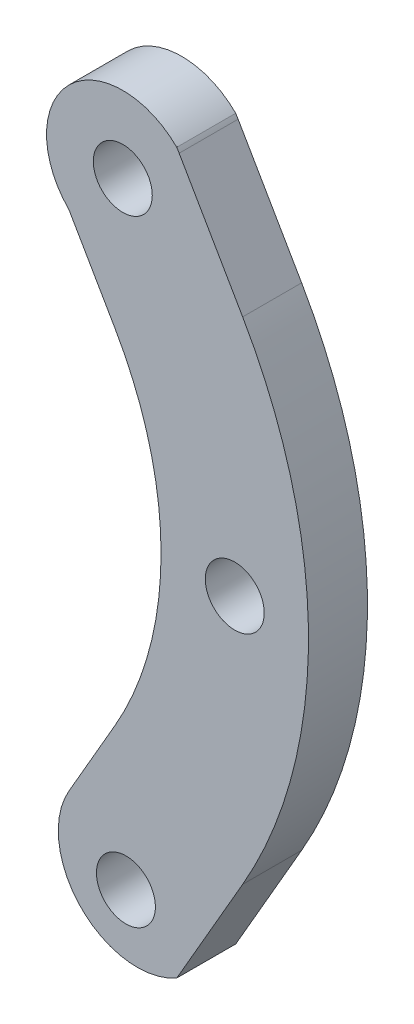
ISO-10303-21;
HEADER;
FILE_DESCRIPTION(('STEP AP214'),'2;1');
FILE_NAME('part.step','',(''),(''),'','','');
FILE_SCHEMA(('AUTOMOTIVE_DESIGN { 1 0 10303 214 1 1 1 1 }'));
ENDSEC;
DATA;
#1=APPLICATION_CONTEXT('core data for automotive mechanical design processes');
#2=APPLICATION_PROTOCOL_DEFINITION('international standard','automotive_design',2000,#1);
#3=PRODUCT_CONTEXT('',#1,'mechanical');
#4=PRODUCT('Part','Part','',(#3));
#5=PRODUCT_RELATED_PRODUCT_CATEGORY('part','',(#4));
#6=PRODUCT_DEFINITION_FORMATION('','',#4);
#7=PRODUCT_DEFINITION_CONTEXT('part definition',#1,'design');
#8=PRODUCT_DEFINITION('design','',#6,#7);
#9=PRODUCT_DEFINITION_SHAPE('','',#8);
#10=(LENGTH_UNIT() NAMED_UNIT(*) SI_UNIT(.MILLI.,.METRE.));
#11=(NAMED_UNIT(*) PLANE_ANGLE_UNIT() SI_UNIT($,.RADIAN.));
#12=(NAMED_UNIT(*) SI_UNIT($,.STERADIAN.) SOLID_ANGLE_UNIT());
#13=UNCERTAINTY_MEASURE_WITH_UNIT(LENGTH_MEASURE(1.E-05),#10,'distance_accuracy_value','');
#14=(GEOMETRIC_REPRESENTATION_CONTEXT(3) GLOBAL_UNCERTAINTY_ASSIGNED_CONTEXT((#13)) GLOBAL_UNIT_ASSIGNED_CONTEXT((#10,
#11,#12)) REPRESENTATION_CONTEXT('',''));
#15=CARTESIAN_POINT('',(0.,0.,0.));
#16=DIRECTION('',(0.,0.,1.));
#17=DIRECTION('',(1.,0.,0.));
#18=AXIS2_PLACEMENT_3D('',#15,#16,#17);
#19=CARTESIAN_POINT('',(29.893674629435,31.1070049645989,6.));
#20=DIRECTION('',(0.,0.,-1.));
#21=DIRECTION('',(-1.,0.,0.));
#22=AXIS2_PLACEMENT_3D('',#19,#20,#21);
#23=CYLINDRICAL_SURFACE('',#22,7.75728199138995);
#24=CARTESIAN_POINT('',(29.893674629435,31.1070049645989,0.));
#25=DIRECTION('',(0.,0.,1.));
#26=DIRECTION('',(1.,0.,0.));
#27=AXIS2_PLACEMENT_3D('',#24,#25,#26);
#28=CIRCLE('',#27,7.75728199138995);
#29=CARTESIAN_POINT('',(24.4084479297469,25.6217782649108,0.));
#30=VERTEX_POINT('',#29);
#31=CARTESIAN_POINT('',(35.3789013291231,36.592231664287,0.));
#32=VERTEX_POINT('',#31);
#33=EDGE_CURVE('E146',#30,#32,#28,.F.);
#34=ORIENTED_EDGE('',*,*,#33,.F.);
#35=DIRECTION('',(0.,0.,-1.));
#36=VECTOR('',#35,1.);
#37=CARTESIAN_POINT('',(24.4084479297469,25.6217782649108,6.));
#38=LINE('',#37,#36);
#39=CARTESIAN_POINT('',(24.4084479297469,25.6217782649108,6.));
#40=VERTEX_POINT('',#39);
#41=EDGE_CURVE('E11',#40,#30,#38,.T.);
#42=ORIENTED_EDGE('',*,*,#41,.F.);
#43=CARTESIAN_POINT('',(29.893674629435,31.1070049645989,6.));
#44=DIRECTION('',(0.,0.,1.));
#45=DIRECTION('',(1.,0.,0.));
#46=AXIS2_PLACEMENT_3D('',#43,#44,#45);
#47=CIRCLE('',#46,7.75728199138995);
#48=CARTESIAN_POINT('',(35.3789013291231,36.592231664287,6.));
#49=VERTEX_POINT('',#48);
#50=EDGE_CURVE('E331',#40,#49,#47,.F.);
#51=ORIENTED_EDGE('',*,*,#50,.T.);
#52=DIRECTION('',(0.,0.,-1.));
#53=VECTOR('',#52,1.);
#54=CARTESIAN_POINT('',(35.3789013291231,36.592231664287,6.));
#55=LINE('',#54,#53);
#56=EDGE_CURVE('E89',#49,#32,#55,.T.);
#57=ORIENTED_EDGE('',*,*,#56,.T.);
#58=EDGE_LOOP('',(#34,#42,#51,#57));
#59=FACE_BOUND('',#58,.T.);
#60=ADVANCED_FACE('F34',(#59),#23,.T.);
#61=CARTESIAN_POINT('',(29.4008913810825,16.974612553283,6.));
#62=DIRECTION('',(-0.866025403784438,-0.500000000000001,0.));
#63=DIRECTION('',(0.500000000000001,-0.866025403784438,0.));
#64=AXIS2_PLACEMENT_3D('',#61,#62,#63);
#65=PLANE('',#64);
#66=DIRECTION('',(-0.500000000000001,0.866025403784438,0.));
#67=VECTOR('',#66,1.);
#68=CARTESIAN_POINT('',(29.4008913810825,16.974612553283,0.));
#69=LINE('',#68,#67);
#70=CARTESIAN_POINT('',(29.0975587972916,17.5000000000001,0.));
#71=VERTEX_POINT('',#70);
#72=EDGE_CURVE('E148',#71,#30,#69,.T.);
#73=ORIENTED_EDGE('',*,*,#72,.F.);
#74=DIRECTION('',(0.,0.,-1.));
#75=VECTOR('',#74,1.);
#76=CARTESIAN_POINT('',(29.0975587972916,17.5000000000001,6.));
#77=LINE('',#76,#75);
#78=CARTESIAN_POINT('',(29.0975587972916,17.5000000000001,6.));
#79=VERTEX_POINT('',#78);
#80=EDGE_CURVE('E43',#79,#71,#77,.T.);
#81=ORIENTED_EDGE('',*,*,#80,.F.);
#82=DIRECTION('',(-0.500000000000001,0.866025403784438,0.));
#83=VECTOR('',#82,1.);
#84=CARTESIAN_POINT('',(29.4008913810825,16.974612553283,6.));
#85=LINE('',#84,#83);
#86=EDGE_CURVE('E191',#79,#40,#85,.T.);
#87=ORIENTED_EDGE('',*,*,#86,.T.);
#88=ORIENTED_EDGE('',*,*,#41,.T.);
#89=EDGE_LOOP('',(#73,#81,#87,#88));
#90=FACE_BOUND('',#89,.T.);
#91=ADVANCED_FACE('F190',(#90),#65,.T.);
#92=CARTESIAN_POINT('',(-1.21333033516375,0.,6.));
#93=DIRECTION('',(0.,0.,-1.));
#94=DIRECTION('',(-1.,0.,0.));
#95=AXIS2_PLACEMENT_3D('',#92,#93,#94);
#96=CYLINDRICAL_SURFACE('',#95,35.);
#97=CARTESIAN_POINT('',(-1.21333033516375,0.,0.));
#98=DIRECTION('',(0.,0.,1.));
#99=DIRECTION('',(1.,0.,0.));
#100=AXIS2_PLACEMENT_3D('',#97,#98,#99);
#101=CIRCLE('',#100,35.);
#102=CARTESIAN_POINT('',(29.0975587972916,-17.5,0.));
#103=VERTEX_POINT('',#102);
#104=EDGE_CURVE('E151',#71,#103,#101,.F.);
#105=ORIENTED_EDGE('',*,*,#104,.T.);
#106=DIRECTION('',(0.,0.,-1.));
#107=VECTOR('',#106,1.);
#108=CARTESIAN_POINT('',(29.0975587972916,-17.5,6.));
#109=LINE('',#108,#107);
#110=CARTESIAN_POINT('',(29.0975587972916,-17.5,6.));
#111=VERTEX_POINT('',#110);
#112=EDGE_CURVE('E176',#111,#103,#109,.T.);
#113=ORIENTED_EDGE('',*,*,#112,.F.);
#114=CARTESIAN_POINT('',(-1.21333033516375,0.,6.));
#115=DIRECTION('',(0.,0.,1.));
#116=DIRECTION('',(1.,0.,0.));
#117=AXIS2_PLACEMENT_3D('',#114,#115,#116);
#118=CIRCLE('',#117,35.);
#119=EDGE_CURVE('E184',#79,#111,#118,.F.);
#120=ORIENTED_EDGE('',*,*,#119,.F.);
#121=ORIENTED_EDGE('',*,*,#80,.T.);
#122=EDGE_LOOP('',(#105,#113,#120,#121));
#123=FACE_BOUND('',#122,.T.);
#124=ADVANCED_FACE('F181',(#123),#96,.F.);
#125=CARTESIAN_POINT('',(29.4008913810825,-16.974612553283,6.));
#126=DIRECTION('',(0.866025403784438,-0.500000000000001,0.));
#127=DIRECTION('',(0.500000000000001,0.866025403784438,0.));
#128=AXIS2_PLACEMENT_3D('',#125,#126,#127);
#129=PLANE('',#128);
#130=DIRECTION('',(-0.500000000000001,-0.866025403784438,0.));
#131=VECTOR('',#130,1.);
#132=CARTESIAN_POINT('',(29.4008913810825,-16.974612553283,0.));
#133=LINE('',#132,#131);
#134=CARTESIAN_POINT('',(24.4084479297469,-25.6217782649108,0.));
#135=VERTEX_POINT('',#134);
#136=EDGE_CURVE('E154',#103,#135,#133,.T.);
#137=ORIENTED_EDGE('',*,*,#136,.T.);
#138=DIRECTION('',(0.,0.,-1.));
#139=VECTOR('',#138,1.);
#140=CARTESIAN_POINT('',(24.4084479297469,-25.6217782649108,6.));
#141=LINE('',#140,#139);
#142=CARTESIAN_POINT('',(24.4084479297469,-25.6217782649108,6.));
#143=VERTEX_POINT('',#142);
#144=EDGE_CURVE('E173',#143,#135,#141,.T.);
#145=ORIENTED_EDGE('',*,*,#144,.F.);
#146=DIRECTION('',(-0.500000000000001,-0.866025403784438,0.));
#147=VECTOR('',#146,1.);
#148=CARTESIAN_POINT('',(29.4008913810825,-16.974612553283,6.));
#149=LINE('',#148,#147);
#150=EDGE_CURVE('E328',#111,#143,#149,.T.);
#151=ORIENTED_EDGE('',*,*,#150,.F.);
#152=ORIENTED_EDGE('',*,*,#112,.T.);
#153=EDGE_LOOP('',(#137,#145,#151,#152));
#154=FACE_BOUND('',#153,.T.);
#155=ADVANCED_FACE('F243',(#154),#129,.F.);
#156=CARTESIAN_POINT('',(31.3699721568132,-29.6410161513776,6.));
#157=DIRECTION('',(0.,0.,-1.));
#158=DIRECTION('',(-1.,0.,0.));
#159=AXIS2_PLACEMENT_3D('',#156,#157,#158);
#160=CYLINDRICAL_SURFACE('',#159,8.03847577293367);
#161=CARTESIAN_POINT('',(31.3699721568132,-29.6410161513776,0.));
#162=DIRECTION('',(0.,0.,1.));
#163=DIRECTION('',(1.,0.,0.));
#164=AXIS2_PLACEMENT_3D('',#161,#162,#163);
#165=CIRCLE('',#164,8.03847577293367);
#166=CARTESIAN_POINT('',(35.38921004328,-36.6025403784439,0.));
#167=VERTEX_POINT('',#166);
#168=EDGE_CURVE('E157',#135,#167,#165,.T.);
#169=ORIENTED_EDGE('',*,*,#168,.T.);
#170=DIRECTION('',(0.,0.,-1.));
#171=VECTOR('',#170,1.);
#172=CARTESIAN_POINT('',(35.38921004328,-36.6025403784439,6.));
#173=LINE('',#172,#171);
#174=CARTESIAN_POINT('',(35.38921004328,-36.6025403784439,6.));
#175=VERTEX_POINT('',#174);
#176=EDGE_CURVE('E171',#175,#167,#173,.T.);
#177=ORIENTED_EDGE('',*,*,#176,.F.);
#178=CARTESIAN_POINT('',(31.3699721568132,-29.6410161513776,6.));
#179=DIRECTION('',(0.,0.,1.));
#180=DIRECTION('',(1.,0.,0.));
#181=AXIS2_PLACEMENT_3D('',#178,#179,#180);
#182=CIRCLE('',#181,8.03847577293367);
#183=EDGE_CURVE('E132',#143,#175,#182,.T.);
#184=ORIENTED_EDGE('',*,*,#183,.F.);
#185=ORIENTED_EDGE('',*,*,#144,.T.);
#186=EDGE_LOOP('',(#169,#177,#184,#185));
#187=FACE_BOUND('',#186,.T.);
#188=ADVANCED_FACE('F239',(#187),#160,.T.);
#189=CARTESIAN_POINT('',(42.3912724378491,-24.474612553283,6.));
#190=DIRECTION('',(0.866025403784438,-0.5,0.));
#191=DIRECTION('',(0.5,0.866025403784438,0.));
#192=AXIS2_PLACEMENT_3D('',#189,#190,#191);
#193=PLANE('',#192);
#194=DIRECTION('',(-0.5,-0.866025403784438,0.));
#195=VECTOR('',#194,1.);
#196=CARTESIAN_POINT('',(42.3912724378491,-24.474612553283,0.));
#197=LINE('',#196,#195);
#198=CARTESIAN_POINT('',(42.0879398540581,-25.,0.));
#199=VERTEX_POINT('',#198);
#200=EDGE_CURVE('E160',#199,#167,#197,.T.);
#201=ORIENTED_EDGE('',*,*,#200,.F.);
#202=DIRECTION('',(0.,0.,-1.));
#203=VECTOR('',#202,1.);
#204=CARTESIAN_POINT('',(42.0879398540581,-25.,6.));
#205=LINE('',#204,#203);
#206=CARTESIAN_POINT('',(42.0879398540581,-25.,6.));
#207=VERTEX_POINT('',#206);
#208=EDGE_CURVE('E120',#207,#199,#205,.T.);
#209=ORIENTED_EDGE('',*,*,#208,.F.);
#210=DIRECTION('',(-0.5,-0.866025403784438,0.));
#211=VECTOR('',#210,1.);
#212=CARTESIAN_POINT('',(42.3912724378491,-24.474612553283,6.));
#213=LINE('',#212,#211);
#214=EDGE_CURVE('E130',#207,#175,#213,.T.);
#215=ORIENTED_EDGE('',*,*,#214,.T.);
#216=ORIENTED_EDGE('',*,*,#176,.T.);
#217=EDGE_LOOP('',(#201,#209,#215,#216));
#218=FACE_BOUND('',#217,.T.);
#219=ADVANCED_FACE('F236',(#218),#193,.T.);
#220=CARTESIAN_POINT('',(-1.21333033516375,0.,6.));
#221=DIRECTION('',(0.,0.,-1.));
#222=DIRECTION('',(-1.,0.,0.));
#223=AXIS2_PLACEMENT_3D('',#220,#221,#222);
#224=CYLINDRICAL_SURFACE('',#223,50.);
#225=CARTESIAN_POINT('',(-1.21333033516375,0.,0.));
#226=DIRECTION('',(0.,0.,1.));
#227=DIRECTION('',(1.,0.,0.));
#228=AXIS2_PLACEMENT_3D('',#225,#226,#227);
#229=CIRCLE('',#228,50.);
#230=CARTESIAN_POINT('',(42.0879398540581,25.0000000000001,0.));
#231=VERTEX_POINT('',#230);
#232=EDGE_CURVE('E117',#231,#199,#229,.F.);
#233=ORIENTED_EDGE('',*,*,#232,.F.);
#234=DIRECTION('',(0.,0.,-1.));
#235=VECTOR('',#234,1.);
#236=CARTESIAN_POINT('',(42.0879398540581,25.0000000000001,6.));
#237=LINE('',#236,#235);
#238=CARTESIAN_POINT('',(42.0879398540581,25.0000000000001,6.));
#239=VERTEX_POINT('',#238);
#240=EDGE_CURVE('E111',#239,#231,#237,.T.);
#241=ORIENTED_EDGE('',*,*,#240,.F.);
#242=CARTESIAN_POINT('',(-1.21333033516375,0.,6.));
#243=DIRECTION('',(0.,0.,1.));
#244=DIRECTION('',(1.,0.,0.));
#245=AXIS2_PLACEMENT_3D('',#242,#243,#244);
#246=CIRCLE('',#245,50.);
#247=EDGE_CURVE('E115',#239,#207,#246,.F.);
#248=ORIENTED_EDGE('',*,*,#247,.T.);
#249=ORIENTED_EDGE('',*,*,#208,.T.);
#250=EDGE_LOOP('',(#233,#241,#248,#249));
#251=FACE_BOUND('',#250,.T.);
#252=ADVANCED_FACE('F113',(#251),#224,.T.);
#253=CARTESIAN_POINT('',(42.3912724378491,24.4746125532829,6.));
#254=DIRECTION('',(-0.866025403784438,-0.5,0.));
#255=DIRECTION('',(0.5,-0.866025403784439,0.));
#256=AXIS2_PLACEMENT_3D('',#253,#254,#255);
#257=PLANE('',#256);
#258=DIRECTION('',(-0.5,0.866025403784439,0.));
#259=VECTOR('',#258,1.);
#260=CARTESIAN_POINT('',(42.3912724378491,24.4746125532829,0.));
#261=LINE('',#260,#259);
#262=CARTESIAN_POINT('',(35.6271150010397,36.1904769042316,0.));
#263=VERTEX_POINT('',#262);
#264=EDGE_CURVE('E164',#231,#263,#261,.T.);
#265=ORIENTED_EDGE('',*,*,#264,.T.);
#266=DIRECTION('',(0.,0.,-1.));
#267=VECTOR('',#266,1.);
#268=CARTESIAN_POINT('',(35.6271150010397,36.1904769042316,6.));
#269=LINE('',#268,#267);
#270=CARTESIAN_POINT('',(35.6271150010397,36.1904769042316,6.));
#271=VERTEX_POINT('',#270);
#272=EDGE_CURVE('E121',#271,#263,#269,.T.);
#273=ORIENTED_EDGE('',*,*,#272,.F.);
#274=DIRECTION('',(-0.5,0.866025403784439,0.));
#275=VECTOR('',#274,1.);
#276=CARTESIAN_POINT('',(42.3912724378491,24.4746125532829,6.));
#277=LINE('',#276,#275);
#278=EDGE_CURVE('E124',#239,#271,#277,.T.);
#279=ORIENTED_EDGE('',*,*,#278,.F.);
#280=ORIENTED_EDGE('',*,*,#240,.T.);
#281=EDGE_LOOP('',(#265,#273,#279,#280));
#282=FACE_BOUND('',#281,.T.);
#283=ADVANCED_FACE('F125',(#282),#257,.F.);
#284=CARTESIAN_POINT('',(41.2866696648363,0.,6.));
#285=DIRECTION('',(0.,0.,-1.));
#286=DIRECTION('',(-1.,0.,0.));
#287=AXIS2_PLACEMENT_3D('',#284,#285,#286);
#288=CYLINDRICAL_SURFACE('',#287,3.);
#289=CARTESIAN_POINT('',(41.2866696648363,0.,6.));
#290=DIRECTION('',(0.,0.,1.));
#291=DIRECTION('',(1.,0.,0.));
#292=AXIS2_PLACEMENT_3D('',#289,#290,#291);
#293=CIRCLE('',#292,3.);
#294=CARTESIAN_POINT('',(44.2866696648363,0.,6.));
#295=VERTEX_POINT('',#294);
#296=EDGE_CURVE('E337',#295,#295,#293,.T.);
#297=ORIENTED_EDGE('',*,*,#296,.T.);
#298=EDGE_LOOP('',(#297));
#299=FACE_BOUND('',#298,.T.);
#300=CARTESIAN_POINT('',(41.2866696648363,0.,0.));
#301=DIRECTION('',(0.,0.,1.));
#302=DIRECTION('',(1.,0.,0.));
#303=AXIS2_PLACEMENT_3D('',#300,#301,#302);
#304=CIRCLE('',#303,3.);
#305=CARTESIAN_POINT('',(44.2866696648363,0.,0.));
#306=VERTEX_POINT('',#305);
#307=EDGE_CURVE('E143',#306,#306,#304,.T.);
#308=ORIENTED_EDGE('',*,*,#307,.F.);
#309=EDGE_LOOP('',(#308));
#310=FACE_BOUND('',#309,.T.);
#311=ADVANCED_FACE('F200',(#299,#310),#288,.F.);
#312=CARTESIAN_POINT('',(30.2120024790528,-31.4253328142167,6.));
#313=DIRECTION('',(0.,0.,-1.));
#314=DIRECTION('',(-1.,0.,0.));
#315=AXIS2_PLACEMENT_3D('',#312,#313,#314);
#316=CYLINDRICAL_SURFACE('',#315,3.);
#317=CARTESIAN_POINT('',(30.2120024790528,-31.4253328142167,6.));
#318=DIRECTION('',(0.,0.,1.));
#319=DIRECTION('',(1.,0.,0.));
#320=AXIS2_PLACEMENT_3D('',#317,#318,#319);
#321=CIRCLE('',#320,3.);
#322=CARTESIAN_POINT('',(33.2120024790528,-31.4253328142167,6.));
#323=VERTEX_POINT('',#322);
#324=EDGE_CURVE('E214',#323,#323,#321,.T.);
#325=ORIENTED_EDGE('',*,*,#324,.T.);
#326=EDGE_LOOP('',(#325));
#327=FACE_BOUND('',#326,.T.);
#328=CARTESIAN_POINT('',(30.2120024790528,-31.4253328142167,0.));
#329=DIRECTION('',(0.,0.,1.));
#330=DIRECTION('',(1.,0.,0.));
#331=AXIS2_PLACEMENT_3D('',#328,#329,#330);
#332=CIRCLE('',#331,3.);
#333=CARTESIAN_POINT('',(33.2120024790528,-31.4253328142167,0.));
#334=VERTEX_POINT('',#333);
#335=EDGE_CURVE('E140',#334,#334,#332,.T.);
#336=ORIENTED_EDGE('',*,*,#335,.F.);
#337=EDGE_LOOP('',(#336));
#338=FACE_BOUND('',#337,.T.);
#339=ADVANCED_FACE('F202',(#327,#338),#316,.F.);
#340=CARTESIAN_POINT('',(29.893674629435,31.1070049645989,6.));
#341=DIRECTION('',(0.,0.,-1.));
#342=DIRECTION('',(-1.,0.,0.));
#343=AXIS2_PLACEMENT_3D('',#340,#341,#342);
#344=CYLINDRICAL_SURFACE('',#343,3.);
#345=CARTESIAN_POINT('',(29.893674629435,31.1070049645989,6.));
#346=DIRECTION('',(0.,0.,1.));
#347=DIRECTION('',(1.,0.,0.));
#348=AXIS2_PLACEMENT_3D('',#345,#346,#347);
#349=CIRCLE('',#348,3.);
#350=CARTESIAN_POINT('',(32.893674629435,31.1070049645989,6.));
#351=VERTEX_POINT('',#350);
#352=EDGE_CURVE('E167',#351,#351,#349,.T.);
#353=ORIENTED_EDGE('',*,*,#352,.T.);
#354=EDGE_LOOP('',(#353));
#355=FACE_BOUND('',#354,.T.);
#356=CARTESIAN_POINT('',(29.893674629435,31.1070049645989,0.));
#357=DIRECTION('',(0.,0.,1.));
#358=DIRECTION('',(1.,0.,0.));
#359=AXIS2_PLACEMENT_3D('',#356,#357,#358);
#360=CIRCLE('',#359,3.);
#361=CARTESIAN_POINT('',(32.893674629435,31.1070049645989,0.));
#362=VERTEX_POINT('',#361);
#363=EDGE_CURVE('E137',#362,#362,#360,.T.);
#364=ORIENTED_EDGE('',*,*,#363,.F.);
#365=EDGE_LOOP('',(#364));
#366=FACE_BOUND('',#365,.T.);
#367=ADVANCED_FACE('F36',(#355,#366),#344,.F.);
#368=CARTESIAN_POINT('',(28.7694673862238,32.2312122078101,6.));
#369=DIRECTION('',(0.,0.,-1.));
#370=DIRECTION('',(-1.,0.,0.));
#371=AXIS2_PLACEMENT_3D('',#368,#369,#370);
#372=CYLINDRICAL_SURFACE('',#371,7.9185293928431);
#373=CARTESIAN_POINT('',(28.7694673862238,32.2312122078101,0.));
#374=DIRECTION('',(0.,0.,1.));
#375=DIRECTION('',(1.,0.,0.));
#376=AXIS2_PLACEMENT_3D('',#373,#374,#375);
#377=CIRCLE('',#376,7.9185293928431);
#378=EDGE_CURVE('E82',#263,#32,#377,.T.);
#379=ORIENTED_EDGE('',*,*,#378,.T.);
#380=ORIENTED_EDGE('',*,*,#56,.F.);
#381=CARTESIAN_POINT('',(28.7694673862238,32.2312122078101,6.));
#382=DIRECTION('',(0.,0.,1.));
#383=DIRECTION('',(1.,0.,0.));
#384=AXIS2_PLACEMENT_3D('',#381,#382,#383);
#385=CIRCLE('',#384,7.9185293928431);
#386=EDGE_CURVE('E51',#271,#49,#385,.T.);
#387=ORIENTED_EDGE('',*,*,#386,.F.);
#388=ORIENTED_EDGE('',*,*,#272,.T.);
#389=EDGE_LOOP('',(#379,#380,#387,#388));
#390=FACE_BOUND('',#389,.T.);
#391=ADVANCED_FACE('F209',(#390),#372,.T.);
#392=CARTESIAN_POINT('',(0.,0.,6.));
#393=DIRECTION('',(0.,0.,1.));
#394=DIRECTION('',(1.,0.,0.));
#395=AXIS2_PLACEMENT_3D('',#392,#393,#394);
#396=PLANE('',#395);
#397=ORIENTED_EDGE('',*,*,#352,.F.);
#398=EDGE_LOOP('',(#397));
#399=FACE_BOUND('',#398,.T.);
#400=ORIENTED_EDGE('',*,*,#324,.F.);
#401=EDGE_LOOP('',(#400));
#402=FACE_BOUND('',#401,.T.);
#403=ORIENTED_EDGE('',*,*,#296,.F.);
#404=EDGE_LOOP('',(#403));
#405=FACE_BOUND('',#404,.T.);
#406=ORIENTED_EDGE('',*,*,#50,.F.);
#407=ORIENTED_EDGE('',*,*,#86,.F.);
#408=ORIENTED_EDGE('',*,*,#119,.T.);
#409=ORIENTED_EDGE('',*,*,#150,.T.);
#410=ORIENTED_EDGE('',*,*,#183,.T.);
#411=ORIENTED_EDGE('',*,*,#214,.F.);
#412=ORIENTED_EDGE('',*,*,#247,.F.);
#413=ORIENTED_EDGE('',*,*,#278,.T.);
#414=ORIENTED_EDGE('',*,*,#386,.T.);
#415=EDGE_LOOP('',(#406,#407,#408,#409,#410,#411,#412,#413,#414));
#416=FACE_BOUND('',#415,.T.);
#417=ADVANCED_FACE('F128',(#399,#402,#405,#416),#396,.T.);
#418=CARTESIAN_POINT('',(0.,0.,0.));
#419=DIRECTION('',(0.,0.,1.));
#420=DIRECTION('',(1.,0.,0.));
#421=AXIS2_PLACEMENT_3D('',#418,#419,#420);
#422=PLANE('',#421);
#423=ORIENTED_EDGE('',*,*,#363,.T.);
#424=EDGE_LOOP('',(#423));
#425=FACE_BOUND('',#424,.T.);
#426=ORIENTED_EDGE('',*,*,#335,.T.);
#427=EDGE_LOOP('',(#426));
#428=FACE_BOUND('',#427,.T.);
#429=ORIENTED_EDGE('',*,*,#307,.T.);
#430=EDGE_LOOP('',(#429));
#431=FACE_BOUND('',#430,.T.);
#432=ORIENTED_EDGE('',*,*,#33,.T.);
#433=ORIENTED_EDGE('',*,*,#378,.F.);
#434=ORIENTED_EDGE('',*,*,#264,.F.);
#435=ORIENTED_EDGE('',*,*,#232,.T.);
#436=ORIENTED_EDGE('',*,*,#200,.T.);
#437=ORIENTED_EDGE('',*,*,#168,.F.);
#438=ORIENTED_EDGE('',*,*,#136,.F.);
#439=ORIENTED_EDGE('',*,*,#104,.F.);
#440=ORIENTED_EDGE('',*,*,#72,.T.);
#441=EDGE_LOOP('',(#432,#433,#434,#435,#436,#437,#438,#439,#440));
#442=FACE_BOUND('',#441,.T.);
#443=ADVANCED_FACE('F189',(#425,#428,#431,#442),#422,.F.);
#444=CLOSED_SHELL('',(#60,#91,#124,#155,#188,#219,#252,#283,#311,#339,#367,#391,#417,#443));
#445=MANIFOLD_SOLID_BREP('B2',#444);
#446=ADVANCED_BREP_SHAPE_REPRESENTATION('',(#18,#445),#14);
#447=SHAPE_DEFINITION_REPRESENTATION(#9,#446);
ENDSEC;
END-ISO-10303-21;
